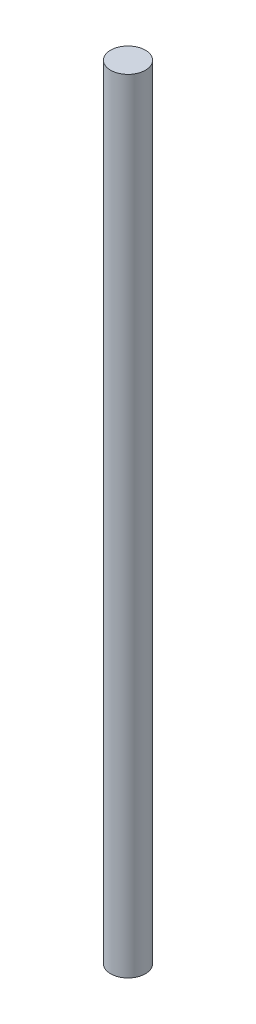
ISO-10303-21;
HEADER;
FILE_DESCRIPTION(('STEP AP214'),'2;1');
FILE_NAME('part.step','',(''),(''),'','','');
FILE_SCHEMA(('AUTOMOTIVE_DESIGN { 1 0 10303 214 1 1 1 1 }'));
ENDSEC;
DATA;
#1=APPLICATION_CONTEXT('core data for automotive mechanical design processes');
#2=APPLICATION_PROTOCOL_DEFINITION('international standard','automotive_design',2000,#1);
#3=PRODUCT_CONTEXT('',#1,'mechanical');
#4=PRODUCT('Part','Part','',(#3));
#5=PRODUCT_RELATED_PRODUCT_CATEGORY('part','',(#4));
#6=PRODUCT_DEFINITION_FORMATION('','',#4);
#7=PRODUCT_DEFINITION_CONTEXT('part definition',#1,'design');
#8=PRODUCT_DEFINITION('design','',#6,#7);
#9=PRODUCT_DEFINITION_SHAPE('','',#8);
#10=(LENGTH_UNIT() NAMED_UNIT(*) SI_UNIT(.MILLI.,.METRE.));
#11=(NAMED_UNIT(*) PLANE_ANGLE_UNIT() SI_UNIT($,.RADIAN.));
#12=(NAMED_UNIT(*) SI_UNIT($,.STERADIAN.) SOLID_ANGLE_UNIT());
#13=UNCERTAINTY_MEASURE_WITH_UNIT(LENGTH_MEASURE(1.E-05),#10,'distance_accuracy_value','');
#14=(GEOMETRIC_REPRESENTATION_CONTEXT(3) GLOBAL_UNCERTAINTY_ASSIGNED_CONTEXT((#13)) GLOBAL_UNIT_ASSIGNED_CONTEXT((#10,
#11,#12)) REPRESENTATION_CONTEXT('',''));
#15=CARTESIAN_POINT('',(0.,0.,0.));
#16=DIRECTION('',(0.,0.,1.));
#17=DIRECTION('',(1.,0.,0.));
#18=AXIS2_PLACEMENT_3D('',#15,#16,#17);
#19=CARTESIAN_POINT('',(-10.1411949797072,90.,-2.03564132804342));
#20=DIRECTION('',(0.,-1.,0.));
#21=DIRECTION('',(0.,0.,-1.));
#22=AXIS2_PLACEMENT_3D('',#19,#20,#21);
#23=CYLINDRICAL_SURFACE('',#22,2.);
#24=CARTESIAN_POINT('',(-10.1411949797072,90.,-2.03564132804342));
#25=DIRECTION('',(0.,1.,0.));
#26=DIRECTION('',(0.,0.,1.));
#27=AXIS2_PLACEMENT_3D('',#24,#25,#26);
#28=CIRCLE('',#27,2.);
#29=CARTESIAN_POINT('',(-10.1411949797072,90.,-4.03564132804342));
#30=VERTEX_POINT('',#29);
#31=EDGE_CURVE('E10',#30,#30,#28,.T.);
#32=CARTESIAN_POINT('',(-10.1411949797072,0.,-2.03564132804342));
#33=DIRECTION('',(0.,1.,0.));
#34=DIRECTION('',(0.,0.,1.));
#35=AXIS2_PLACEMENT_3D('',#32,#33,#34);
#36=CIRCLE('',#35,2.);
#37=CARTESIAN_POINT('',(-10.1411949797072,0.,-4.03564132804342));
#38=VERTEX_POINT('',#37);
#39=EDGE_CURVE('E41',#38,#38,#36,.T.);
#40=CARTESIAN_POINT('',(-10.1411949797072,90.,-4.03564132804342));
#41=CARTESIAN_POINT('',(-10.1411949797072,89.0625,-4.03564132804342));
#42=CARTESIAN_POINT('',(-10.1411949797072,88.125,-4.03564132804342));
#43=CARTESIAN_POINT('',(-10.1411949797072,86.25,-4.03564132804342));
#44=CARTESIAN_POINT('',(-10.1411949797072,85.3125,-4.03564132804342));
#45=CARTESIAN_POINT('',(-10.1411949797072,83.4375,-4.03564132804342));
#46=CARTESIAN_POINT('',(-10.1411949797072,82.5,-4.03564132804342));
#47=CARTESIAN_POINT('',(-10.1411949797072,80.625,-4.03564132804342));
#48=CARTESIAN_POINT('',(-10.1411949797072,79.6875,-4.03564132804342));
#49=CARTESIAN_POINT('',(-10.1411949797072,77.8125,-4.03564132804342));
#50=CARTESIAN_POINT('',(-10.1411949797072,76.875,-4.03564132804342));
#51=CARTESIAN_POINT('',(-10.1411949797072,75.,-4.03564132804342));
#52=CARTESIAN_POINT('',(-10.1411949797072,74.0625,-4.03564132804342));
#53=CARTESIAN_POINT('',(-10.1411949797072,72.1875,-4.03564132804342));
#54=CARTESIAN_POINT('',(-10.1411949797072,71.25,-4.03564132804342));
#55=CARTESIAN_POINT('',(-10.1411949797072,69.375,-4.03564132804342));
#56=CARTESIAN_POINT('',(-10.1411949797072,68.4375,-4.03564132804342));
#57=CARTESIAN_POINT('',(-10.1411949797072,66.5625,-4.03564132804342));
#58=CARTESIAN_POINT('',(-10.1411949797072,65.625,-4.03564132804342));
#59=CARTESIAN_POINT('',(-10.1411949797072,63.75,-4.03564132804342));
#60=CARTESIAN_POINT('',(-10.1411949797072,62.8125,-4.03564132804342));
#61=CARTESIAN_POINT('',(-10.1411949797072,60.9375,-4.03564132804342));
#62=CARTESIAN_POINT('',(-10.1411949797072,60.,-4.03564132804342));
#63=CARTESIAN_POINT('',(-10.1411949797072,58.125,-4.03564132804342));
#64=CARTESIAN_POINT('',(-10.1411949797072,57.1875,-4.03564132804342));
#65=CARTESIAN_POINT('',(-10.1411949797072,55.3125,-4.03564132804342));
#66=CARTESIAN_POINT('',(-10.1411949797072,54.375,-4.03564132804342));
#67=CARTESIAN_POINT('',(-10.1411949797072,52.5,-4.03564132804342));
#68=CARTESIAN_POINT('',(-10.1411949797072,51.5625,-4.03564132804342));
#69=CARTESIAN_POINT('',(-10.1411949797072,49.6875,-4.03564132804342));
#70=CARTESIAN_POINT('',(-10.1411949797072,48.75,-4.03564132804342));
#71=CARTESIAN_POINT('',(-10.1411949797072,46.875,-4.03564132804342));
#72=CARTESIAN_POINT('',(-10.1411949797072,45.9375,-4.03564132804342));
#73=CARTESIAN_POINT('',(-10.1411949797072,44.0625,-4.03564132804342));
#74=CARTESIAN_POINT('',(-10.1411949797072,43.125,-4.03564132804342));
#75=CARTESIAN_POINT('',(-10.1411949797072,41.25,-4.03564132804342));
#76=CARTESIAN_POINT('',(-10.1411949797072,40.3125,-4.03564132804342));
#77=CARTESIAN_POINT('',(-10.1411949797072,38.4375,-4.03564132804342));
#78=CARTESIAN_POINT('',(-10.1411949797072,37.5,-4.03564132804342));
#79=CARTESIAN_POINT('',(-10.1411949797072,35.625,-4.03564132804342));
#80=CARTESIAN_POINT('',(-10.1411949797072,34.6875,-4.03564132804342));
#81=CARTESIAN_POINT('',(-10.1411949797072,32.8125,-4.03564132804342));
#82=CARTESIAN_POINT('',(-10.1411949797072,31.875,-4.03564132804342));
#83=CARTESIAN_POINT('',(-10.1411949797072,30.,-4.03564132804342));
#84=CARTESIAN_POINT('',(-10.1411949797072,29.0625,-4.03564132804342));
#85=CARTESIAN_POINT('',(-10.1411949797072,27.1875,-4.03564132804342));
#86=CARTESIAN_POINT('',(-10.1411949797072,26.25,-4.03564132804342));
#87=CARTESIAN_POINT('',(-10.1411949797072,24.375,-4.03564132804342));
#88=CARTESIAN_POINT('',(-10.1411949797072,23.4375,-4.03564132804342));
#89=CARTESIAN_POINT('',(-10.1411949797072,21.5625,-4.03564132804342));
#90=CARTESIAN_POINT('',(-10.1411949797072,20.625,-4.03564132804342));
#91=CARTESIAN_POINT('',(-10.1411949797072,18.75,-4.03564132804342));
#92=CARTESIAN_POINT('',(-10.1411949797072,17.8125,-4.03564132804342));
#93=CARTESIAN_POINT('',(-10.1411949797072,15.9375,-4.03564132804342));
#94=CARTESIAN_POINT('',(-10.1411949797072,15.,-4.03564132804342));
#95=CARTESIAN_POINT('',(-10.1411949797072,13.125,-4.03564132804342));
#96=CARTESIAN_POINT('',(-10.1411949797072,12.1875,-4.03564132804342));
#97=CARTESIAN_POINT('',(-10.1411949797072,10.3125,-4.03564132804342));
#98=CARTESIAN_POINT('',(-10.1411949797072,9.37499999999999,-4.03564132804342));
#99=CARTESIAN_POINT('',(-10.1411949797072,7.49999999999999,-4.03564132804342));
#100=CARTESIAN_POINT('',(-10.1411949797072,6.56249999999999,-4.03564132804342));
#101=CARTESIAN_POINT('',(-10.1411949797072,4.68749999999999,-4.03564132804342));
#102=CARTESIAN_POINT('',(-10.1411949797072,3.74999999999998,-4.03564132804342));
#103=CARTESIAN_POINT('',(-10.1411949797072,1.87499999999998,-4.03564132804342));
#104=CARTESIAN_POINT('',(-10.1411949797072,0.937499999999986,-4.03564132804342));
#105=CARTESIAN_POINT('',(-10.1411949797072,0.,-4.03564132804342));
#106=B_SPLINE_CURVE_WITH_KNOTS('',3,(#40,#41,#42,#43,#44,#45,#46,#47,#48,#49,#50,#51,#52,#53,
#54,#55,#56,#57,#58,#59,#60,#61,#62,#63,#64,#65,#66,#67,#68,#69,#70,#71,#72,#73,#74,#75,#76,#77,
#78,#79,#80,#81,#82,#83,#84,#85,#86,#87,#88,#89,#90,#91,#92,#93,#94,#95,#96,#97,#98,#99,#100,
#101,#102,#103,#104,#105),.UNSPECIFIED.,.F.,.F.,(4,2,2,2,2,2,2,2,2,2,2,2,2,2,2,2,2,2,2,2,2,2,2,
2,2,2,2,2,2,2,2,2,4),(0.,2.8125,5.62499999999999,8.43749999999999,11.25,14.0625,16.875,19.6875,
22.5,25.3125,28.125,30.9375,33.75,36.5625,39.375,42.1875,45.,47.8125,50.625,53.4375,56.25,
59.0625,61.875,64.6875,67.5,70.3125,73.125,75.9375,78.75,81.5625,84.375,87.1875,90.),.UNSPECIFIED.);
#107=EDGE_CURVE('BSEAM38',#30,#38,#106,.T.);
#108=ORIENTED_EDGE('',*,*,#31,.F.);
#109=ORIENTED_EDGE('',*,*,#39,.T.);
#110=ORIENTED_EDGE('',*,*,#107,.T.);
#111=ORIENTED_EDGE('',*,*,#107,.F.);
#112=EDGE_LOOP('',(#108,#110,#109,#111));
#113=FACE_BOUND('',#112,.T.);
#114=ADVANCED_FACE('F38',(#113),#23,.T.);
#115=CARTESIAN_POINT('',(-10.1411949797072,90.,-2.03564132804342));
#116=DIRECTION('',(0.,1.,0.));
#117=DIRECTION('',(0.,0.,1.));
#118=AXIS2_PLACEMENT_3D('',#115,#116,#117);
#119=PLANE('',#118);
#120=ORIENTED_EDGE('',*,*,#31,.T.);
#121=EDGE_LOOP('',(#120));
#122=FACE_BOUND('',#121,.T.);
#123=ADVANCED_FACE('F53',(#122),#119,.T.);
#124=CARTESIAN_POINT('',(-10.1411949797072,0.,-2.03564132804342));
#125=DIRECTION('',(0.,1.,0.));
#126=DIRECTION('',(0.,0.,1.));
#127=AXIS2_PLACEMENT_3D('',#124,#125,#126);
#128=PLANE('',#127);
#129=ORIENTED_EDGE('',*,*,#39,.F.);
#130=EDGE_LOOP('',(#129));
#131=FACE_BOUND('',#130,.T.);
#132=ADVANCED_FACE('F51',(#131),#128,.F.);
#133=CLOSED_SHELL('',(#114,#123,#132));
#134=MANIFOLD_SOLID_BREP('B2',#133);
#135=ADVANCED_BREP_SHAPE_REPRESENTATION('',(#18,#134),#14);
#136=SHAPE_DEFINITION_REPRESENTATION(#9,#135);
ENDSEC;
END-ISO-10303-21;
